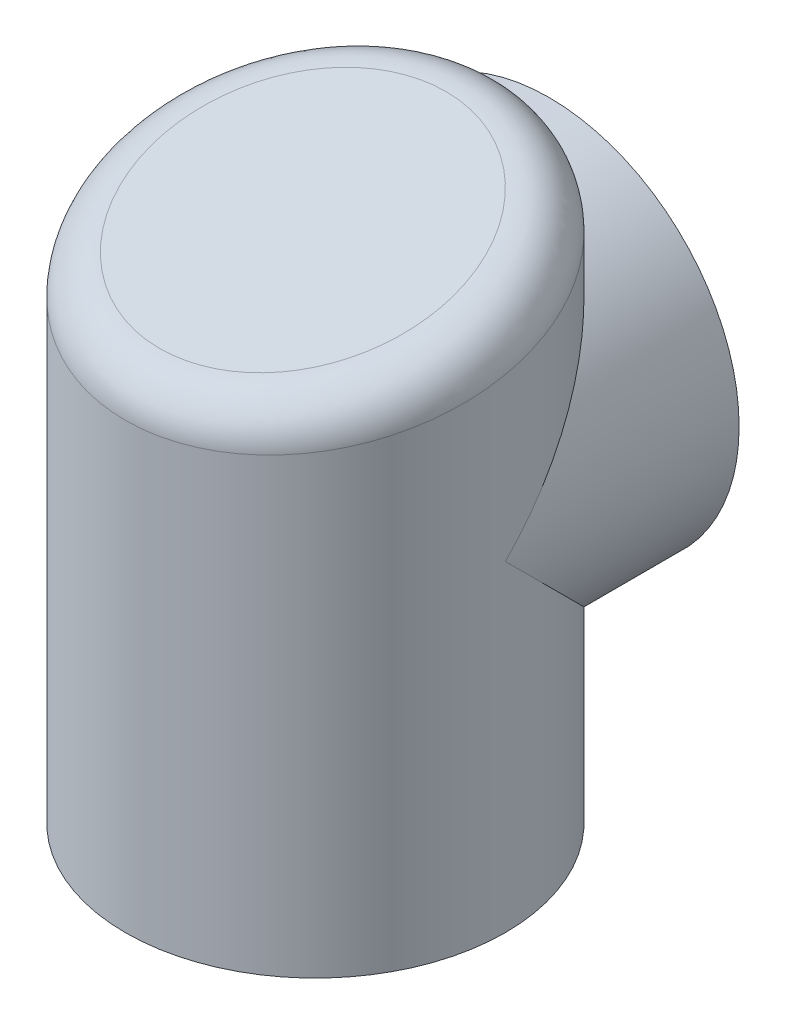
ISO-10303-21;
HEADER;
FILE_DESCRIPTION(('STEP AP214'),'2;1');
FILE_NAME('part.step','',(''),(''),'','','');
FILE_SCHEMA(('AUTOMOTIVE_DESIGN { 1 0 10303 214 1 1 1 1 }'));
ENDSEC;
DATA;
#1=APPLICATION_CONTEXT('core data for automotive mechanical design processes');
#2=APPLICATION_PROTOCOL_DEFINITION('international standard','automotive_design',2000,#1);
#3=PRODUCT_CONTEXT('',#1,'mechanical');
#4=PRODUCT('Part','Part','',(#3));
#5=PRODUCT_RELATED_PRODUCT_CATEGORY('part','',(#4));
#6=PRODUCT_DEFINITION_FORMATION('','',#4);
#7=PRODUCT_DEFINITION_CONTEXT('part definition',#1,'design');
#8=PRODUCT_DEFINITION('design','',#6,#7);
#9=PRODUCT_DEFINITION_SHAPE('','',#8);
#10=(LENGTH_UNIT() NAMED_UNIT(*) SI_UNIT(.MILLI.,.METRE.));
#11=(NAMED_UNIT(*) PLANE_ANGLE_UNIT() SI_UNIT($,.RADIAN.));
#12=(NAMED_UNIT(*) SI_UNIT($,.STERADIAN.) SOLID_ANGLE_UNIT());
#13=UNCERTAINTY_MEASURE_WITH_UNIT(LENGTH_MEASURE(1.E-05),#10,'distance_accuracy_value','');
#14=(GEOMETRIC_REPRESENTATION_CONTEXT(3) GLOBAL_UNCERTAINTY_ASSIGNED_CONTEXT((#13)) GLOBAL_UNIT_ASSIGNED_CONTEXT((#10,
#11,#12)) REPRESENTATION_CONTEXT('',''));
#15=CARTESIAN_POINT('',(0.,0.,0.));
#16=DIRECTION('',(0.,0.,1.));
#17=DIRECTION('',(1.,0.,0.));
#18=AXIS2_PLACEMENT_3D('',#15,#16,#17);
#19=CARTESIAN_POINT('',(0.,-55.,0.));
#20=DIRECTION('',(0.,1.,0.));
#21=DIRECTION('',(0.,0.,1.));
#22=AXIS2_PLACEMENT_3D('',#19,#20,#21);
#23=CYLINDRICAL_SURFACE('',#22,32.5);
#24=CARTESIAN_POINT('',(0.,0.,0.));
#25=DIRECTION('',(0.,0.707106781186547,0.707106781186547));
#26=DIRECTION('',(0.,0.707106781186547,-0.707106781186547));
#27=AXIS2_PLACEMENT_3D('',#24,#25,#26);
#28=ELLIPSE('',#27,45.9619407771256,32.5);
#29=CARTESIAN_POINT('',(-32.5,0.,0.));
#30=VERTEX_POINT('',#29);
#31=CARTESIAN_POINT('',(32.5,0.,0.));
#32=VERTEX_POINT('',#31);
#33=EDGE_CURVE('E11',#30,#32,#28,.F.);
#34=ORIENTED_EDGE('',*,*,#33,.F.);
#35=CARTESIAN_POINT('',(0.,0.,0.));
#36=DIRECTION('',(0.,0.707106781186547,-0.707106781186547));
#37=DIRECTION('',(0.,0.707106781186547,0.707106781186547));
#38=AXIS2_PLACEMENT_3D('',#35,#36,#37);
#39=ELLIPSE('',#38,45.9619407771256,32.5);
#40=EDGE_CURVE('E44',#32,#30,#39,.T.);
#41=ORIENTED_EDGE('',*,*,#40,.F.);
#42=EDGE_LOOP('',(#34,#41));
#43=FACE_BOUND('',#42,.T.);
#44=CARTESIAN_POINT('',(0.,27.6989200103792,0.));
#45=DIRECTION('',(0.,0.978897454177588,0.204352083925357));
#46=DIRECTION('',(0.,0.204352083925357,-0.978897454177588));
#47=AXIS2_PLACEMENT_3D('',#44,#45,#46);
#48=ELLIPSE('',#47,33.2006175532498,32.5);
#49=CARTESIAN_POINT('',(0.,34.4835353949946,-32.5));
#50=VERTEX_POINT('',#49);
#51=EDGE_CURVE('E53',#50,#50,#48,.F.);
#52=ORIENTED_EDGE('',*,*,#51,.T.);
#53=EDGE_LOOP('',(#52));
#54=FACE_BOUND('',#53,.T.);
#55=CARTESIAN_POINT('',(0.,-55.,0.));
#56=DIRECTION('',(0.,1.,0.));
#57=DIRECTION('',(0.,0.,1.));
#58=AXIS2_PLACEMENT_3D('',#55,#56,#57);
#59=CIRCLE('',#58,32.5);
#60=CARTESIAN_POINT('',(0.,-55.,32.5));
#61=VERTEX_POINT('',#60);
#62=EDGE_CURVE('E61',#61,#61,#59,.T.);
#63=ORIENTED_EDGE('',*,*,#62,.T.);
#64=EDGE_LOOP('',(#63));
#65=FACE_BOUND('',#64,.T.);
#66=ADVANCED_FACE('F34',(#43,#54,#65),#23,.T.);
#67=CARTESIAN_POINT('',(0.,-55.,0.));
#68=DIRECTION('',(0.,1.,0.));
#69=DIRECTION('',(0.,0.,1.));
#70=AXIS2_PLACEMENT_3D('',#67,#68,#69);
#71=PLANE('',#70);
#72=ORIENTED_EDGE('',*,*,#62,.F.);
#73=EDGE_LOOP('',(#72));
#74=FACE_BOUND('',#73,.T.);
#75=ADVANCED_FACE('F77',(#74),#71,.F.);
#76=CARTESIAN_POINT('',(-32.5,27.,32.5));
#77=DIRECTION('',(0.,-0.963730021877003,-0.266879082981324));
#78=DIRECTION('',(0.,0.266879082981324,-0.963730021877003));
#79=AXIS2_PLACEMENT_3D('',#76,#77,#78);
#80=PLANE('',#79);
#81=CARTESIAN_POINT('',(0.,35.4087601853952,2.13503266385059));
#82=DIRECTION('',(0.,-0.963730021877003,-0.266879082981324));
#83=DIRECTION('',(0.,0.266879082981324,-0.963730021877003));
#84=AXIS2_PLACEMENT_3D('',#81,#82,#83);
#85=ELLIPSE('',#84,25.4220574682137,24.5);
#86=CARTESIAN_POINT('',(0.,42.1933755700106,-22.3649673361494));
#87=VERTEX_POINT('',#86);
#88=EDGE_CURVE('E55',#87,#87,#85,.F.);
#89=ORIENTED_EDGE('',*,*,#88,.T.);
#90=EDGE_LOOP('',(#89));
#91=FACE_BOUND('',#90,.T.);
#92=ADVANCED_FACE('F81',(#91),#80,.F.);
#93=CARTESIAN_POINT('',(0.,42.1933755700106,-22.3649673361494));
#94=CARTESIAN_POINT('',(0.,45.,-32.5));
#95=CARTESIAN_POINT('',(0.,34.4835353949946,-32.5));
#96=CARTESIAN_POINT('',(1.06924434522681,42.1933755700106,-22.3649673361494));
#97=CARTESIAN_POINT('',(1.54548645104082,45.,-32.5));
#98=CARTESIAN_POINT('',(1.41838535591311,34.4835353949946,-32.5));
#99=CARTESIAN_POINT('',(2.13848869045361,42.1739553912125,-22.2948389127119));
#100=CARTESIAN_POINT('',(3.08936208830327,44.9696507137399,-32.3904053551717));
#101=CARTESIAN_POINT('',(2.83677071182621,34.4641152161965,-32.4069724995217));
#102=CARTESIAN_POINT('',(4.25866567339952,42.096659117348,-22.0157134793122));
#103=CARTESIAN_POINT('',(6.14506394387571,44.8490090053969,-31.954754741711));
#104=CARTESIAN_POINT('',(5.649250383081,34.386818942332,-32.0367040674608));
#105=CARTESIAN_POINT('',(5.3095728238446,42.0387332900319,-21.8065368806706));
#106=CARTESIAN_POINT('',(7.65378934807155,44.7588863200155,-31.6293117111669));
#107=CARTESIAN_POINT('',(7.04331088877345,34.3288931150159,-31.7592249059975));
#108=CARTESIAN_POINT('',(7.37513087703055,41.8854667906104,-21.2530745216488));
#109=CARTESIAN_POINT('',(10.605413190052,44.5212427382731,-30.7711543326528));
#110=CARTESIAN_POINT('',(9.78333687769359,34.1756266155944,-31.0250401440298));
#111=CARTESIAN_POINT('',(8.38968490266562,41.7900332401345,-20.9084533671525));
#112=CARTESIAN_POINT('',(12.0455575385312,44.3740419698602,-30.239596002273));
#113=CARTESIAN_POINT('',(11.1291738504748,34.0801930651185,-30.5678896329633));
#114=CARTESIAN_POINT('',(10.3652593805427,41.5634252791691,-20.090146841444));
#115=CARTESIAN_POINT('',(14.8292506535656,44.0263691325449,-28.984110756412));
#116=CARTESIAN_POINT('',(13.7498338721484,33.8535851041531,-29.4823809764112));
#117=CARTESIAN_POINT('',(11.3260797362572,41.4321267707966,-19.6160133389877));
#118=CARTESIAN_POINT('',(16.1705745238066,43.8263323832121,-28.2617558282659));
#119=CARTESIAN_POINT('',(15.0243914868718,33.7222865957806,-28.853428371112));
#120=CARTESIAN_POINT('',(13.1778572161929,41.1360627120165,-18.5468931267262));
#121=CARTESIAN_POINT('',(18.7299749031086,43.3783855119313,-26.6441699041962));
#122=CARTESIAN_POINT('',(17.4808310010722,33.4262225370005,-27.4352076813774));
#123=CARTESIAN_POINT('',(14.0684991975832,40.9711569379257,-17.9514000536205));
#124=CARTESIAN_POINT('',(19.9464767357548,43.1309807764081,-25.7507639148071));
#125=CARTESIAN_POINT('',(18.6622948539369,33.2613167629097,-26.6452678905229));
#126=CARTESIAN_POINT('',(15.7647973838157,40.6107108855089,-16.649789308782));
#127=CARTESIAN_POINT('',(22.2343175551335,42.5946102860866,-23.8138704775351));
#128=CARTESIAN_POINT('',(20.9124863254697,32.9008707104928,-24.9186413922677));
#129=CARTESIAN_POINT('',(16.5700334188763,40.4150299368776,-15.9431636609468));
#130=CARTESIAN_POINT('',(23.304786002799,42.3061716560193,-22.7722865356251));
#131=CARTESIAN_POINT('',(21.9806565760604,32.7051897618616,-23.9812808390169));
#132=CARTESIAN_POINT('',(18.0818423231959,39.9963765704697,-14.4313598378072));
#133=CARTESIAN_POINT('',(25.283540276231,41.6946131107513,-20.5638806777131));
#134=CARTESIAN_POINT('',(23.9861173675048,32.2865363954537,-21.9758267879134));
#135=CARTESIAN_POINT('',(18.7879196884399,39.7732768580017,-13.6257219872284));
#136=CARTESIAN_POINT('',(26.1916519609946,41.3719964562922,-19.3988760921663));
#137=CARTESIAN_POINT('',(24.9227506071142,32.0634366829857,-20.9071235167374));
#138=CARTESIAN_POINT('',(20.089395229619,39.3035847014364,-11.9296114218537));
#139=CARTESIAN_POINT('',(27.83337392125,40.6992311192949,-16.9694457085647));
#140=CARTESIAN_POINT('',(26.6491977535763,31.5937445264204,-18.6571809300159));
#141=CARTESIAN_POINT('',(20.6842666776997,39.0568884244832,-11.0387637550782));
#142=CARTESIAN_POINT('',(28.5674497936242,40.3495230811064,-15.7066111262176));
#143=CARTESIAN_POINT('',(27.4383129398057,31.3470482494672,-17.4754442291913));
#144=CARTESIAN_POINT('',(21.7531689309521,38.5441965170346,-9.18737631151399));
#145=CARTESIAN_POINT('',(29.8530709239934,39.6297642661872,-13.1074820723427));
#146=CARTESIAN_POINT('',(28.8562445002426,30.8343563420186,-15.0195221101775));
#147=CARTESIAN_POINT('',(22.2266933315444,38.2781257745022,-8.22656529681346));
#148=CARTESIAN_POINT('',(30.4056313463288,39.2600616562172,-11.7724448696731));
#149=CARTESIAN_POINT('',(29.4843891132732,30.5682855994862,-13.7449768865952));
#150=CARTESIAN_POINT('',(23.0447626735891,37.7312059015808,-6.25157686681938));
#151=CARTESIAN_POINT('',(31.323982512383,38.5073828445093,-9.05443804961684));
#152=CARTESIAN_POINT('',(30.5695831384345,30.0213657265647,-11.1250942753785));
#153=CARTESIAN_POINT('',(23.3888731572819,37.4503105386025,-5.23723250050882));
#154=CARTESIAN_POINT('',(31.6912285873375,38.1246416466295,-7.67231705727307));
#155=CARTESIAN_POINT('',(31.0260562290475,29.7404703635864,-9.77953542210942));
#156=CARTESIAN_POINT('',(23.9421385250327,36.8785173486725,-3.17242375909506));
#157=CARTESIAN_POINT('',(32.2380105411069,37.3527326794693,-4.88486800919474));
#158=CARTESIAN_POINT('',(31.7599796760638,29.1686771736565,-7.04050341819321));
#159=CARTESIAN_POINT('',(24.1509759117879,36.5875976656689,-2.12188045935995));
#160=CARTESIAN_POINT('',(32.4193242201298,36.9636744101758,-3.47993537007916));
#161=CARTESIAN_POINT('',(32.0370088625758,28.8777574906529,-5.64692557160581));
#162=CARTESIAN_POINT('',(24.4299903868042,36.0007091598972,-0.0025608551844436));
#163=CARTESIAN_POINT('',(32.5961718743086,36.1856959554084,-0.67056872786374));
#164=CARTESIAN_POINT('',(32.4071301049443,28.2908689848812,-2.83558323953627));
#165=CARTESIAN_POINT('',(24.5,35.7047346726462,1.06623590433307));
#166=CARTESIAN_POINT('',(32.5936871058693,35.7967545000546,0.733942083136279));
#167=CARTESIAN_POINT('',(32.5,27.9948944976302,-1.41779161976813));
#168=CARTESIAN_POINT('',(24.5,35.1127856981442,3.2038294233681));
#169=CARTESIAN_POINT('',(32.4073973276728,35.0252569268429,3.5199055419561));
#170=CARTESIAN_POINT('',(32.5,27.4029455231282,1.41779161976813));
#171=CARTESIAN_POINT('',(24.4299903868042,34.8168112108932,4.27262618288561));
#172=CARTESIAN_POINT('',(32.2256603250304,34.6425494065527,4.90190492078215));
#173=CARTESIAN_POINT('',(32.4071301049443,27.1069710358772,2.83558323953626));
#174=CARTESIAN_POINT('',(24.1509759117879,34.2299227051215,6.39194578706112));
#175=CARTESIAN_POINT('',(31.6875948324661,33.8894261198101,7.62151678957475));
#176=CARTESIAN_POINT('',(32.0370088625758,26.5200825301055,5.64692557160581));
#177=CARTESIAN_POINT('',(23.9421385250327,33.939003022118,7.44248908679623));
#178=CARTESIAN_POINT('',(31.3333082061878,33.5187346024316,8.96012504677469));
#179=CARTESIAN_POINT('',(31.7599796760638,26.229162847102,7.0405034181932));
#180=CARTESIAN_POINT('',(23.3888731572819,33.367209832188,9.50729782820999));
#181=CARTESIAN_POINT('',(30.458947053843,32.7951875405598,11.5729338813119));
#182=CARTESIAN_POINT('',(31.0260562290475,25.657369657172,9.77953542210941));
#183=CARTESIAN_POINT('',(23.0447626735891,33.0863144692097,10.5216421945205));
#184=CARTESIAN_POINT('',(29.9407799837141,32.4419425836194,12.8485406702632));
#185=CARTESIAN_POINT('',(30.5695831384345,25.3764742941937,11.1250942753785));
#186=CARTESIAN_POINT('',(22.2266933315444,32.5393945962883,12.4966306245146));
#187=CARTESIAN_POINT('',(28.7493843904409,31.7584458311247,15.3167233876053));
#188=CARTESIAN_POINT('',(29.4843891132732,24.8295544212723,13.7449768865952));
#189=CARTESIAN_POINT('',(21.7531689309521,32.2733238537558,13.4574416392152));
#190=CARTESIAN_POINT('',(28.0778267135732,31.4277067323039,16.5110590222361));
#191=CARTESIAN_POINT('',(28.8562445002426,24.5634836787398,15.0195221101775));
#192=CARTESIAN_POINT('',(20.6842666776997,31.7606319463072,15.3088290827794));
#193=CARTESIAN_POINT('',(26.5921669643258,30.793961273189,18.7995842912621));
#194=CARTESIAN_POINT('',(27.4383129398057,24.0507917712912,17.4754442291913));
#195=CARTESIAN_POINT('',(20.089395229619,31.513935669354,16.1996767495549));
#196=CARTESIAN_POINT('',(25.7794059873364,30.4903909493586,19.8958104606494));
#197=CARTESIAN_POINT('',(26.6491977535763,23.804095494338,18.6571809300159));
#198=CARTESIAN_POINT('',(18.7879196884399,31.0442435127887,17.8957873149295));
#199=CARTESIAN_POINT('',(24.0255151431123,29.9152688212633,21.9726403676604));
#200=CARTESIAN_POINT('',(24.9227506071142,23.3344033377727,20.9071235167374));
#201=CARTESIAN_POINT('',(18.0818423231959,30.8211438003208,18.7014251655084));
#202=CARTESIAN_POINT('',(23.085317557927,29.6431033315163,22.9554601917469));
#203=CARTESIAN_POINT('',(23.9861173675048,23.1113036253048,21.9758267879134));
#204=CARTESIAN_POINT('',(16.5700334188763,30.4024904339129,20.2132289886479));
#205=CARTESIAN_POINT('',(21.0922403248083,29.1345828484675,24.7917841583118));
#206=CARTESIAN_POINT('',(21.9806565760604,22.6926502588969,23.9812808390169));
#207=CARTESIAN_POINT('',(15.7647973838157,30.2068094852816,20.9198546364831));
#208=CARTESIAN_POINT('',(20.0398260322952,28.8975968507071,25.6475669280023));
#209=CARTESIAN_POINT('',(20.9124863254698,22.4969693102656,24.9186413922677));
#210=CARTESIAN_POINT('',(14.0684991975832,29.8463634328648,22.2214653813217));
#211=CARTESIAN_POINT('',(17.8393415287805,28.4626924769418,27.2180549443768));
#212=CARTESIAN_POINT('',(18.6622948539369,22.1365232578488,26.6452678905229));
#213=CARTESIAN_POINT('',(13.1778572161929,29.681457658774,22.8169584544274));
#214=CARTESIAN_POINT('',(16.6912404407371,28.264162580688,27.9349684586268));
#215=CARTESIAN_POINT('',(17.4808310010722,21.9716174837579,27.4352076813774));
#216=CARTESIAN_POINT('',(11.3260797362572,29.3853935999939,23.8860786666889));
#217=CARTESIAN_POINT('',(14.3175462363938,27.9088538730817,29.2180276805384));
#218=CARTESIAN_POINT('',(15.0243914868718,21.6755534249779,28.853428371112));
#219=CARTESIAN_POINT('',(10.3652593805427,29.2540950916213,24.3602121691452));
#220=CARTESIAN_POINT('',(13.0914328273465,27.7515221379871,29.7861700572688));
#221=CARTESIAN_POINT('',(13.7498338721484,21.5442549166053,29.4823809764112));
#222=CARTESIAN_POINT('',(8.38968490266563,29.0274871306559,25.1785186948537));
#223=CARTESIAN_POINT('',(10.5807848967926,27.4806862982742,30.7641883673433));
#224=CARTESIAN_POINT('',(11.1291738504748,21.3176469556399,30.5678896329633));
#225=CARTESIAN_POINT('',(7.37513087703056,28.93205358018,25.52313984935));
#226=CARTESIAN_POINT('',(9.29528840163013,27.3667261882032,31.1757109870442));
#227=CARTESIAN_POINT('',(9.7833368776936,21.222213405164,31.0250401440298));
#228=CARTESIAN_POINT('',(5.30957282384461,28.7787870807586,26.0766022083718));
#229=CARTESIAN_POINT('',(6.68559747253237,27.1840784507446,31.8352722612001));
#230=CARTESIAN_POINT('',(7.04331088877346,21.0689469057426,31.7592249059975));
#231=CARTESIAN_POINT('',(4.25866567339953,28.7208612534425,26.2857788070134));
#232=CARTESIAN_POINT('',(5.3600883493277,27.1150654708197,32.0844857998179));
#233=CARTESIAN_POINT('',(5.64925038308101,21.0110210784264,32.0367040674608));
#234=CARTESIAN_POINT('',(2.13848869045361,28.6435649795779,26.5649042404131));
#235=CARTESIAN_POINT('',(2.69047768238764,27.0231109692849,32.4165437220267));
#236=CARTESIAN_POINT('',(2.83677071182622,20.9337248045619,32.4069724995217));
#237=CARTESIAN_POINT('',(1.06924434522681,28.6241448007798,26.6350326638506));
#238=CARTESIAN_POINT('',(1.34483344414155,27.,32.5));
#239=CARTESIAN_POINT('',(1.41838535591311,20.9143046257638,32.5));
#240=CARTESIAN_POINT('',(-1.0692443452268,28.6241448007798,26.6350326638506));
#241=CARTESIAN_POINT('',(-1.34483344414154,27.,32.5));
#242=CARTESIAN_POINT('',(-1.4183853559131,20.9143046257638,32.5));
#243=CARTESIAN_POINT('',(-2.13848869045361,28.6435649795779,26.5649042404131));
#244=CARTESIAN_POINT('',(-2.69047768238763,27.0231109692849,32.4165437220267));
#245=CARTESIAN_POINT('',(-2.83677071182621,20.9337248045619,32.4069724995217));
#246=CARTESIAN_POINT('',(-4.25866567339953,28.7208612534425,26.2857788070134));
#247=CARTESIAN_POINT('',(-5.3600883493277,27.1150654708197,32.0844857998179));
#248=CARTESIAN_POINT('',(-5.64925038308101,21.0110210784264,32.0367040674608));
#249=CARTESIAN_POINT('',(-5.30957282384461,28.7787870807586,26.0766022083718));
#250=CARTESIAN_POINT('',(-6.68559747253237,27.1840784507446,31.8352722612001));
#251=CARTESIAN_POINT('',(-7.04331088877345,21.0689469057426,31.7592249059975));
#252=CARTESIAN_POINT('',(-7.37513087703055,28.93205358018,25.52313984935));
#253=CARTESIAN_POINT('',(-9.29528840163012,27.3667261882032,31.1757109870442));
#254=CARTESIAN_POINT('',(-9.78333687769359,21.222213405164,31.0250401440298));
#255=CARTESIAN_POINT('',(-8.38968490266562,29.0274871306559,25.1785186948537));
#256=CARTESIAN_POINT('',(-10.5807848967926,27.4806862982742,30.7641883673433));
#257=CARTESIAN_POINT('',(-11.1291738504748,21.3176469556399,30.5678896329633));
#258=CARTESIAN_POINT('',(-10.3652593805427,29.2540950916213,24.3602121691452));
#259=CARTESIAN_POINT('',(-13.0914328273464,27.7515221379871,29.7861700572688));
#260=CARTESIAN_POINT('',(-13.7498338721484,21.5442549166053,29.4823809764112));
#261=CARTESIAN_POINT('',(-11.3260797362572,29.3853935999939,23.8860786666889));
#262=CARTESIAN_POINT('',(-14.3175462363938,27.9088538730817,29.2180276805384));
#263=CARTESIAN_POINT('',(-15.0243914868718,21.6755534249779,28.853428371112));
#264=CARTESIAN_POINT('',(-13.1778572161929,29.681457658774,22.8169584544274));
#265=CARTESIAN_POINT('',(-16.6912404407371,28.264162580688,27.9349684586268));
#266=CARTESIAN_POINT('',(-17.4808310010722,21.9716174837579,27.4352076813774));
#267=CARTESIAN_POINT('',(-14.0684991975832,29.8463634328648,22.2214653813217));
#268=CARTESIAN_POINT('',(-17.8393415287805,28.4626924769418,27.2180549443768));
#269=CARTESIAN_POINT('',(-18.6622948539369,22.1365232578488,26.6452678905229));
#270=CARTESIAN_POINT('',(-15.7647973838157,30.2068094852816,20.9198546364831));
#271=CARTESIAN_POINT('',(-20.0398260322952,28.8975968507071,25.6475669280023));
#272=CARTESIAN_POINT('',(-20.9124863254697,22.4969693102656,24.9186413922677));
#273=CARTESIAN_POINT('',(-16.5700334188763,30.4024904339129,20.2132289886479));
#274=CARTESIAN_POINT('',(-21.0922403248083,29.1345828484675,24.7917841583118));
#275=CARTESIAN_POINT('',(-21.9806565760604,22.6926502588969,23.9812808390169));
#276=CARTESIAN_POINT('',(-18.0818423231959,30.8211438003208,18.7014251655084));
#277=CARTESIAN_POINT('',(-23.085317557927,29.6431033315163,22.9554601917469));
#278=CARTESIAN_POINT('',(-23.9861173675048,23.1113036253048,21.9758267879134));
#279=CARTESIAN_POINT('',(-18.7879196884399,31.0442435127887,17.8957873149296));
#280=CARTESIAN_POINT('',(-24.0255151431123,29.9152688212633,21.9726403676604));
#281=CARTESIAN_POINT('',(-24.9227506071142,23.3344033377727,20.9071235167374));
#282=CARTESIAN_POINT('',(-20.089395229619,31.513935669354,16.1996767495549));
#283=CARTESIAN_POINT('',(-25.7794059873364,30.4903909493586,19.8958104606494));
#284=CARTESIAN_POINT('',(-26.6491977535762,23.804095494338,18.6571809300159));
#285=CARTESIAN_POINT('',(-20.6842666776997,31.7606319463072,15.3088290827794));
#286=CARTESIAN_POINT('',(-26.5921669643258,30.793961273189,18.7995842912621));
#287=CARTESIAN_POINT('',(-27.4383129398057,24.0507917712912,17.4754442291913));
#288=CARTESIAN_POINT('',(-21.7531689309521,32.2733238537558,13.4574416392152));
#289=CARTESIAN_POINT('',(-28.0778267135732,31.4277067323039,16.5110590222361));
#290=CARTESIAN_POINT('',(-28.8562445002426,24.5634836787398,15.0195221101775));
#291=CARTESIAN_POINT('',(-22.2266933315444,32.5393945962883,12.4966306245146));
#292=CARTESIAN_POINT('',(-28.7493843904409,31.7584458311247,15.3167233876053));
#293=CARTESIAN_POINT('',(-29.4843891132732,24.8295544212723,13.7449768865952));
#294=CARTESIAN_POINT('',(-23.0447626735891,33.0863144692097,10.5216421945205));
#295=CARTESIAN_POINT('',(-29.9407799837141,32.4419425836194,12.8485406702632));
#296=CARTESIAN_POINT('',(-30.5695831384345,25.3764742941937,11.1250942753785));
#297=CARTESIAN_POINT('',(-23.3888731572819,33.367209832188,9.50729782820999));
#298=CARTESIAN_POINT('',(-30.458947053843,32.7951875405598,11.5729338813119));
#299=CARTESIAN_POINT('',(-31.0260562290475,25.657369657172,9.77953542210941));
#300=CARTESIAN_POINT('',(-23.9421385250327,33.939003022118,7.44248908679623));
#301=CARTESIAN_POINT('',(-31.3333082061878,33.5187346024316,8.96012504677469));
#302=CARTESIAN_POINT('',(-31.7599796760638,26.229162847102,7.0405034181932));
#303=CARTESIAN_POINT('',(-24.1509759117879,34.2299227051215,6.39194578706112));
#304=CARTESIAN_POINT('',(-31.6875948324661,33.8894261198101,7.62151678957475));
#305=CARTESIAN_POINT('',(-32.0370088625758,26.5200825301055,5.64692557160581));
#306=CARTESIAN_POINT('',(-24.4299903868042,34.8168112108932,4.27262618288562));
#307=CARTESIAN_POINT('',(-32.2256603250304,34.6425494065527,4.90190492078215));
#308=CARTESIAN_POINT('',(-32.4071301049443,27.1069710358772,2.83558323953627));
#309=CARTESIAN_POINT('',(-24.5,35.1127856981442,3.20382942336811));
#310=CARTESIAN_POINT('',(-32.4073973276728,35.0252569268429,3.51990554195611));
#311=CARTESIAN_POINT('',(-32.5,27.4029455231282,1.41779161976814));
#312=CARTESIAN_POINT('',(-24.5,35.7047346726462,1.06623590433308));
#313=CARTESIAN_POINT('',(-32.5936871058693,35.7967545000546,0.73394208313629));
#314=CARTESIAN_POINT('',(-32.5,27.9948944976302,-1.41779161976812));
#315=CARTESIAN_POINT('',(-24.4299903868042,36.0007091598972,-0.00256085518443583));
#316=CARTESIAN_POINT('',(-32.5961718743086,36.1856959554084,-0.670568727863729));
#317=CARTESIAN_POINT('',(-32.4071301049443,28.2908689848812,-2.83558323953626));
#318=CARTESIAN_POINT('',(-24.1509759117879,36.5875976656689,-2.12188045935994));
#319=CARTESIAN_POINT('',(-32.4193242201298,36.9636744101758,-3.47993537007915));
#320=CARTESIAN_POINT('',(-32.0370088625758,28.8777574906529,-5.6469255716058));
#321=CARTESIAN_POINT('',(-23.9421385250327,36.8785173486725,-3.17242375909505));
#322=CARTESIAN_POINT('',(-32.2380105411069,37.3527326794693,-4.88486800919473));
#323=CARTESIAN_POINT('',(-31.7599796760638,29.1686771736565,-7.04050341819319));
#324=CARTESIAN_POINT('',(-23.3888731572819,37.4503105386025,-5.23723250050881));
#325=CARTESIAN_POINT('',(-31.6912285873375,38.1246416466295,-7.67231705727305));
#326=CARTESIAN_POINT('',(-31.0260562290475,29.7404703635864,-9.7795354221094));
#327=CARTESIAN_POINT('',(-23.0447626735891,37.7312059015808,-6.25157686681936));
#328=CARTESIAN_POINT('',(-31.323982512383,38.5073828445093,-9.05443804961682));
#329=CARTESIAN_POINT('',(-30.5695831384346,30.0213657265647,-11.1250942753785));
#330=CARTESIAN_POINT('',(-22.2266933315444,38.2781257745022,-8.22656529681345));
#331=CARTESIAN_POINT('',(-30.4056313463288,39.2600616562172,-11.7724448696731));
#332=CARTESIAN_POINT('',(-29.4843891132732,30.5682855994862,-13.7449768865952));
#333=CARTESIAN_POINT('',(-21.7531689309521,38.5441965170346,-9.18737631151399));
#334=CARTESIAN_POINT('',(-29.8530709239934,39.6297642661872,-13.1074820723427));
#335=CARTESIAN_POINT('',(-28.8562445002426,30.8343563420186,-15.0195221101775));
#336=CARTESIAN_POINT('',(-20.6842666776997,39.0568884244832,-11.0387637550782));
#337=CARTESIAN_POINT('',(-28.5674497936242,40.3495230811064,-15.7066111262176));
#338=CARTESIAN_POINT('',(-27.4383129398057,31.3470482494672,-17.4754442291913));
#339=CARTESIAN_POINT('',(-20.089395229619,39.3035847014364,-11.9296114218537));
#340=CARTESIAN_POINT('',(-27.83337392125,40.6992311192948,-16.9694457085647));
#341=CARTESIAN_POINT('',(-26.6491977535763,31.5937445264204,-18.6571809300159));
#342=CARTESIAN_POINT('',(-18.78791968844,39.7732768580017,-13.6257219872284));
#343=CARTESIAN_POINT('',(-26.1916519609946,41.3719964562922,-19.3988760921663));
#344=CARTESIAN_POINT('',(-24.9227506071142,32.0634366829857,-20.9071235167374));
#345=CARTESIAN_POINT('',(-18.0818423231959,39.9963765704697,-14.4313598378072));
#346=CARTESIAN_POINT('',(-25.283540276231,41.6946131107513,-20.563880677713));
#347=CARTESIAN_POINT('',(-23.9861173675048,32.2865363954537,-21.9758267879134));
#348=CARTESIAN_POINT('',(-16.5700334188763,40.4150299368776,-15.9431636609468));
#349=CARTESIAN_POINT('',(-23.304786002799,42.3061716560193,-22.7722865356251));
#350=CARTESIAN_POINT('',(-21.9806565760604,32.7051897618616,-23.9812808390169));
#351=CARTESIAN_POINT('',(-15.7647973838157,40.6107108855089,-16.649789308782));
#352=CARTESIAN_POINT('',(-22.2343175551335,42.5946102860867,-23.8138704775351));
#353=CARTESIAN_POINT('',(-20.9124863254698,32.9008707104928,-24.9186413922677));
#354=CARTESIAN_POINT('',(-14.0684991975832,40.9711569379257,-17.9514000536205));
#355=CARTESIAN_POINT('',(-19.9464767357548,43.1309807764081,-25.7507639148071));
#356=CARTESIAN_POINT('',(-18.6622948539369,33.2613167629097,-26.6452678905229));
#357=CARTESIAN_POINT('',(-13.1778572161929,41.1360627120165,-18.5468931267262));
#358=CARTESIAN_POINT('',(-18.7299749031086,43.3783855119313,-26.6441699041962));
#359=CARTESIAN_POINT('',(-17.4808310010722,33.4262225370005,-27.4352076813774));
#360=CARTESIAN_POINT('',(-11.3260797362572,41.4321267707966,-19.6160133389877));
#361=CARTESIAN_POINT('',(-16.1705745238066,43.8263323832121,-28.2617558282659));
#362=CARTESIAN_POINT('',(-15.0243914868719,33.7222865957806,-28.853428371112));
#363=CARTESIAN_POINT('',(-10.3652593805427,41.5634252791691,-20.090146841444));
#364=CARTESIAN_POINT('',(-14.8292506535656,44.0263691325449,-28.984110756412));
#365=CARTESIAN_POINT('',(-13.7498338721484,33.8535851041531,-29.4823809764112));
#366=CARTESIAN_POINT('',(-8.38968490266562,41.7900332401345,-20.9084533671525));
#367=CARTESIAN_POINT('',(-12.0455575385312,44.3740419698602,-30.239596002273));
#368=CARTESIAN_POINT('',(-11.1291738504748,34.0801930651185,-30.5678896329633));
#369=CARTESIAN_POINT('',(-7.37513087703056,41.8854667906104,-21.2530745216488));
#370=CARTESIAN_POINT('',(-10.605413190052,44.5212427382731,-30.7711543326528));
#371=CARTESIAN_POINT('',(-9.7833368776936,34.1756266155944,-31.0250401440298));
#372=CARTESIAN_POINT('',(-5.30957282384462,42.0387332900319,-21.8065368806706));
#373=CARTESIAN_POINT('',(-7.65378934807157,44.7588863200155,-31.6293117111669));
#374=CARTESIAN_POINT('',(-7.04331088877347,34.3288931150159,-31.7592249059975));
#375=CARTESIAN_POINT('',(-4.25866567339953,42.096659117348,-22.0157134793122));
#376=CARTESIAN_POINT('',(-6.14506394387572,44.8490090053969,-31.954754741711));
#377=CARTESIAN_POINT('',(-5.64925038308101,34.386818942332,-32.0367040674608));
#378=CARTESIAN_POINT('',(-2.13848869045361,42.1739553912125,-22.2948389127119));
#379=CARTESIAN_POINT('',(-3.08936208830328,44.9696507137399,-32.3904053551717));
#380=CARTESIAN_POINT('',(-2.83677071182622,34.4641152161965,-32.4069724995217));
#381=CARTESIAN_POINT('',(-1.0692443452268,42.1933755700106,-22.3649673361494));
#382=CARTESIAN_POINT('',(-1.54548645104082,45.,-32.5));
#383=CARTESIAN_POINT('',(-1.41838535591311,34.4835353949946,-32.5));
#384=CARTESIAN_POINT('',(0.,42.1933755700106,-22.3649673361494));
#385=CARTESIAN_POINT('',(0.,45.,-32.5));
#386=CARTESIAN_POINT('',(0.,34.4835353949946,-32.5));
#387=(BOUNDED_SURFACE() B_SPLINE_SURFACE(3,2,((#93,#94,#95),(#96,#97,#98),(#99,#100,#101),(#102,
#103,#104),(#105,#106,#107),(#108,#109,#110),(#111,#112,#113),(#114,#115,#116),(#117,#118,#119),
(#120,#121,#122),(#123,#124,#125),(#126,#127,#128),(#129,#130,#131),(#132,#133,#134),(#135,#136,
#137),(#138,#139,#140),(#141,#142,#143),(#144,#145,#146),(#147,#148,#149),(#150,#151,#152),
(#153,#154,#155),(#156,#157,#158),(#159,#160,#161),(#162,#163,#164),(#165,#166,#167),(#168,#169,
#170),(#171,#172,#173),(#174,#175,#176),(#177,#178,#179),(#180,#181,#182),(#183,#184,#185),
(#186,#187,#188),(#189,#190,#191),(#192,#193,#194),(#195,#196,#197),(#198,#199,#200),(#201,#202,
#203),(#204,#205,#206),(#207,#208,#209),(#210,#211,#212),(#213,#214,#215),(#216,#217,#218),
(#219,#220,#221),(#222,#223,#224),(#225,#226,#227),(#228,#229,#230),(#231,#232,#233),(#234,#235,
#236),(#237,#238,#239),(#240,#241,#242),(#243,#244,#245),(#246,#247,#248),(#249,#250,#251),
(#252,#253,#254),(#255,#256,#257),(#258,#259,#260),(#261,#262,#263),(#264,#265,#266),(#267,#268,
#269),(#270,#271,#272),(#273,#274,#275),(#276,#277,#278),(#279,#280,#281),(#282,#283,#284),
(#285,#286,#287),(#288,#289,#290),(#291,#292,#293),(#294,#295,#296),(#297,#298,#299),(#300,#301,
#302),(#303,#304,#305),(#306,#307,#308),(#309,#310,#311),(#312,#313,#314),(#315,#316,#317),
(#318,#319,#320),(#321,#322,#323),(#324,#325,#326),(#327,#328,#329),(#330,#331,#332),(#333,#334,
#335),(#336,#337,#338),(#339,#340,#341),(#342,#343,#344),(#345,#346,#347),(#348,#349,#350),
(#351,#352,#353),(#354,#355,#356),(#357,#358,#359),(#360,#361,#362),(#363,#364,#365),(#366,#367,
#368),(#369,#370,#371),(#372,#373,#374),(#375,#376,#377),(#378,#379,#380),(#381,#382,#383),
(#384,#385,#386)),.UNSPECIFIED.,.T.,.F.,.F.) B_SPLINE_SURFACE_WITH_KNOTS((4,2,2,2,2,2,2,2,2,2,2,
2,2,2,2,2,2,2,2,2,2,2,2,2,2,2,2,2,2,2,2,2,2,2,2,2,2,2,2,2,2,2,2,2,2,2,2,2,4),(3,3),(0.,
3.20527891896072,6.41470570351678,9.63213040559724,12.8608320502753,16.1032916406869,
19.3610276842198,22.6345039687828,25.9231126289121,29.2252296475205,32.5383353508406,
35.8591892816096,39.1840468975979,42.5089045135863,45.8297584443552,49.1428641476753,
52.4449811662837,55.733589826413,59.007066110976,62.2648021545089,65.5072617449205,
68.7359633895986,71.953388091679,75.1628148762351,78.3680937951958,81.5733727141565,
84.7827994987126,88.000224200793,91.2289258454711,94.4713854358827,97.7291214794155,
101.002597763979,104.291206424108,107.593323442716,110.906429146036,114.227283076805,
117.552140692794,120.876998308782,124.197852239551,127.510957942871,130.81307496148,
134.101683621609,137.375159906172,140.632895949705,143.875355540116,147.104057184794,
150.321481886875,153.530908671431,156.736187590392),(0.,1.),
.UNSPECIFIED.) GEOMETRIC_REPRESENTATION_ITEM() RATIONAL_B_SPLINE_SURFACE(((1.,0.605442365968337,
1.),(1.,0.605442365968337,1.),(1.,0.605758047613037,1.),(1.,0.607011582275706,1.),(1.,
0.607950239900335,1.),(1.,0.610424376183455,1.),(1.,0.61196133629563,1.),(1.,0.615592063390457,
1.),(1.,0.617687763077367,1.),(1.,0.622383456059265,1.),(1.,0.62498556016704,1.),(1.,
0.630631617863592,1.),(1.,0.633677595413218,1.),(1.,0.640141728385431,1.),(1.,0.643561610933446,
1.),(1.,0.650699267740973,1.),(1.,0.654418345990058,1.),(1.,0.662077856802166,1.),(1.,
0.66601913585451,1.),(1.,0.674046284135962,1.),(1.,0.678132590881944,1.),(1.,0.686374459716985,
1.),(1.,0.690530161421377,1.),(1.,0.698838215583392,1.),(1.,0.702990557962714,1.),(1.,
0.711223004410381,1.),(1.,0.715303108478728,1.),(1.,0.723326626033683,1.),(1.,0.727270198202408,
1.),(1.,0.734961147727855,1.),(1.,0.7387089613788,1.),(1.,0.745954189111946,1.),(1.,
0.749452392473863,1.),(1.,0.756149729067135,1.),(1.,0.759350027198155,1.),(1.,0.765408569523345,
1.),(1.,0.768268319901284,1.),(1.,0.773608565768742,1.),(1.,0.776090818754202,1.),(1.,
0.780644708669268,1.),(1.,0.78271821651139,1.),(1.,0.786429122478169,1.),(1.,0.788068333711379,
1.),(1.,0.790891023223499,1.),(1.,0.792076073251992,1.),(1.,0.793976666988741,1.),(1.,
0.794693370479369,1.),(1.,0.795649304795334,1.),(1.,0.795889151509594,1.),(1.,0.795889151509594,
1.),(1.,0.795649304795334,1.),(1.,0.794693370479369,1.),(1.,0.793976666988741,1.),(1.,
0.792076073251992,1.),(1.,0.790891023223499,1.),(1.,0.788068333711379,1.),(1.,0.786429122478169,
1.),(1.,0.78271821651139,1.),(1.,0.780644708669268,1.),(1.,0.776090818754202,1.),(1.,
0.773608565768742,1.),(1.,0.768268319901284,1.),(1.,0.765408569523345,1.),(1.,0.759350027198155,
1.),(1.,0.756149729067135,1.),(1.,0.749452392473863,1.),(1.,0.745954189111946,1.),(1.,
0.7387089613788,1.),(1.,0.734961147727855,1.),(1.,0.727270198202408,1.),(1.,0.723326626033683,
1.),(1.,0.715303108478728,1.),(1.,0.711223004410381,1.),(1.,0.702990557962714,1.),(1.,
0.698838215583392,1.),(1.,0.690530161421377,1.),(1.,0.686374459716985,1.),(1.,0.678132590881944,
1.),(1.,0.674046284135963,1.),(1.,0.666019135854511,1.),(1.,0.662077856802166,1.),(1.,
0.654418345990058,1.),(1.,0.650699267740973,1.),(1.,0.643561610933446,1.),(1.,0.640141728385431,
1.),(1.,0.633677595413218,1.),(1.,0.630631617863592,1.),(1.,0.62498556016704,1.),(1.,
0.622383456059266,1.),(1.,0.617687763077367,1.),(1.,0.615592063390457,1.),(1.,0.61196133629563,
1.),(1.,0.610424376183455,1.),(1.,0.607950239900335,1.),(1.,0.607011582275706,1.),(1.,
0.605758047613037,1.),(1.,0.605442365968337,1.),(1.,0.605442365968337,1.))) REPRESENTATION_ITEM('') SURFACE());
#388=CARTESIAN_POINT('',(0.,34.4835353949946,-24.5));
#389=DIRECTION('',(1.,0.,0.));
#390=DIRECTION('',(0.,0.,-1.));
#391=AXIS2_PLACEMENT_3D('',#388,#389,#390);
#392=CIRCLE('',#391,8.);
#393=EDGE_CURVE('',#50,#87,#392,.T.);
#394=ORIENTED_EDGE('',*,*,#51,.F.);
#395=ORIENTED_EDGE('',*,*,#88,.F.);
#396=ORIENTED_EDGE('',*,*,#393,.T.);
#397=ORIENTED_EDGE('',*,*,#393,.F.);
#398=EDGE_LOOP('',(#394,#396,#395,#397));
#399=FACE_BOUND('',#398,.T.);
#400=ADVANCED_FACE('F36',(#399),#387,.T.);
#401=CARTESIAN_POINT('',(0.,0.,-40.));
#402=DIRECTION('',(0.,0.,1.));
#403=DIRECTION('',(1.,0.,0.));
#404=AXIS2_PLACEMENT_3D('',#401,#402,#403);
#405=CYLINDRICAL_SURFACE('',#404,32.5);
#406=CARTESIAN_POINT('',(0.,0.,-40.));
#407=DIRECTION('',(0.,0.,1.));
#408=DIRECTION('',(1.,0.,0.));
#409=AXIS2_PLACEMENT_3D('',#406,#407,#408);
#410=CIRCLE('',#409,32.5);
#411=CARTESIAN_POINT('',(32.5,0.,-40.));
#412=VERTEX_POINT('',#411);
#413=EDGE_CURVE('E64',#412,#412,#410,.T.);
#414=ORIENTED_EDGE('',*,*,#413,.T.);
#415=EDGE_LOOP('',(#414));
#416=FACE_BOUND('',#415,.T.);
#417=ORIENTED_EDGE('',*,*,#40,.T.);
#418=ORIENTED_EDGE('',*,*,#33,.T.);
#419=EDGE_LOOP('',(#417,#418));
#420=FACE_BOUND('',#419,.T.);
#421=ADVANCED_FACE('F52',(#416,#420),#405,.T.);
#422=CARTESIAN_POINT('',(0.,0.,-40.));
#423=DIRECTION('',(0.,0.,1.));
#424=DIRECTION('',(1.,0.,0.));
#425=AXIS2_PLACEMENT_3D('',#422,#423,#424);
#426=PLANE('',#425);
#427=ORIENTED_EDGE('',*,*,#413,.F.);
#428=EDGE_LOOP('',(#427));
#429=FACE_BOUND('',#428,.T.);
#430=ADVANCED_FACE('F69',(#429),#426,.F.);
#431=CLOSED_SHELL('',(#66,#75,#92,#400,#421,#430));
#432=MANIFOLD_SOLID_BREP('B2',#431);
#433=ADVANCED_BREP_SHAPE_REPRESENTATION('',(#18,#432),#14);
#434=SHAPE_DEFINITION_REPRESENTATION(#9,#433);
ENDSEC;
END-ISO-10303-21;
